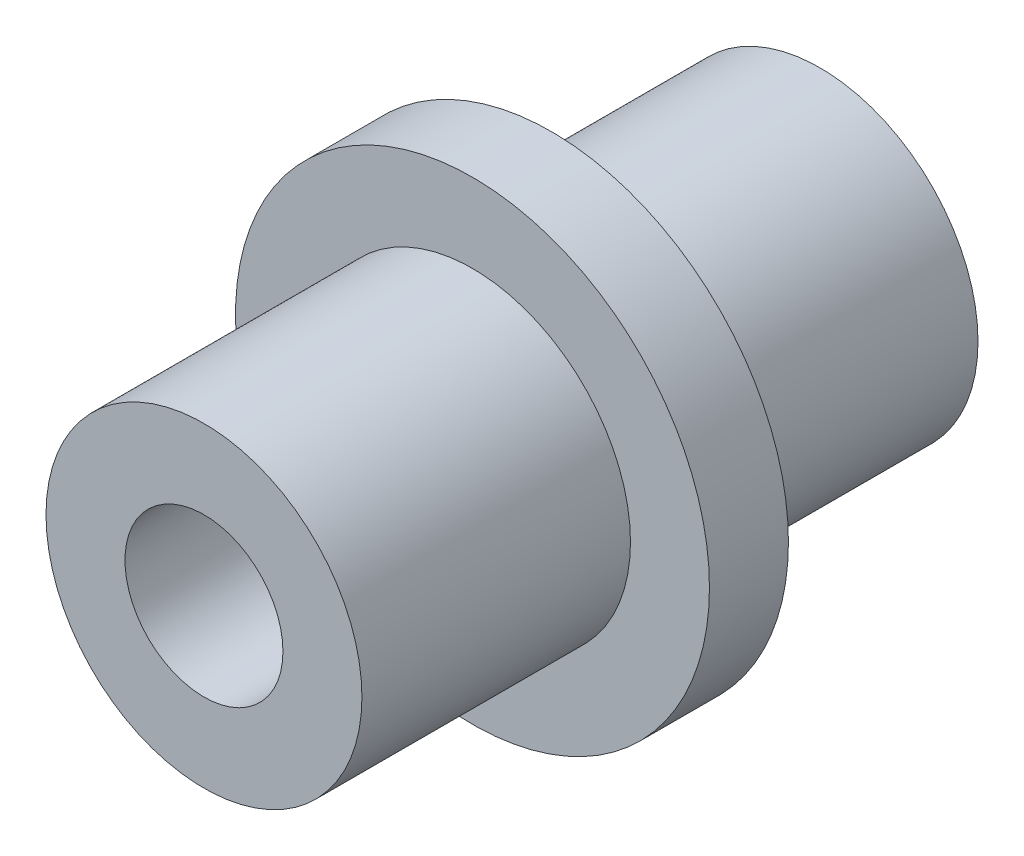
ISO-10303-21;
HEADER;
FILE_DESCRIPTION(('STEP AP214'),'2;1');
FILE_NAME('part.step','',(''),(''),'','','');
FILE_SCHEMA(('AUTOMOTIVE_DESIGN { 1 0 10303 214 1 1 1 1 }'));
ENDSEC;
DATA;
#1=APPLICATION_CONTEXT('core data for automotive mechanical design processes');
#2=APPLICATION_PROTOCOL_DEFINITION('international standard','automotive_design',2000,#1);
#3=PRODUCT_CONTEXT('',#1,'mechanical');
#4=PRODUCT('Part','Part','',(#3));
#5=PRODUCT_RELATED_PRODUCT_CATEGORY('part','',(#4));
#6=PRODUCT_DEFINITION_FORMATION('','',#4);
#7=PRODUCT_DEFINITION_CONTEXT('part definition',#1,'design');
#8=PRODUCT_DEFINITION('design','',#6,#7);
#9=PRODUCT_DEFINITION_SHAPE('','',#8);
#10=(LENGTH_UNIT() NAMED_UNIT(*) SI_UNIT(.MILLI.,.METRE.));
#11=(NAMED_UNIT(*) PLANE_ANGLE_UNIT() SI_UNIT($,.RADIAN.));
#12=(NAMED_UNIT(*) SI_UNIT($,.STERADIAN.) SOLID_ANGLE_UNIT());
#13=UNCERTAINTY_MEASURE_WITH_UNIT(LENGTH_MEASURE(1.E-05),#10,'distance_accuracy_value','');
#14=(GEOMETRIC_REPRESENTATION_CONTEXT(3) GLOBAL_UNCERTAINTY_ASSIGNED_CONTEXT((#13)) GLOBAL_UNIT_ASSIGNED_CONTEXT((#10,
#11,#12)) REPRESENTATION_CONTEXT('',''));
#15=CARTESIAN_POINT('',(0.,0.,0.));
#16=DIRECTION('',(0.,0.,1.));
#17=DIRECTION('',(1.,0.,0.));
#18=AXIS2_PLACEMENT_3D('',#15,#16,#17);
#19=CARTESIAN_POINT('',(0.,0.,0.5));
#20=DIRECTION('',(0.,0.,-1.));
#21=DIRECTION('',(-1.,0.,0.));
#22=AXIS2_PLACEMENT_3D('',#19,#20,#21);
#23=CYLINDRICAL_SURFACE('',#22,3.);
#24=CARTESIAN_POINT('',(0.,0.,0.5));
#25=DIRECTION('',(0.,0.,1.));
#26=DIRECTION('',(1.,0.,0.));
#27=AXIS2_PLACEMENT_3D('',#24,#25,#26);
#28=CIRCLE('',#27,3.);
#29=CARTESIAN_POINT('',(3.,0.,0.5));
#30=VERTEX_POINT('',#29);
#31=EDGE_CURVE('E49',#30,#30,#28,.T.);
#32=ORIENTED_EDGE('',*,*,#31,.F.);
#33=EDGE_LOOP('',(#32));
#34=FACE_BOUND('',#33,.T.);
#35=CARTESIAN_POINT('',(0.,0.,-0.5));
#36=DIRECTION('',(0.,0.,1.));
#37=DIRECTION('',(1.,0.,0.));
#38=AXIS2_PLACEMENT_3D('',#35,#36,#37);
#39=CIRCLE('',#38,3.);
#40=CARTESIAN_POINT('',(3.,0.,-0.5));
#41=VERTEX_POINT('',#40);
#42=EDGE_CURVE('E44',#41,#41,#39,.T.);
#43=ORIENTED_EDGE('',*,*,#42,.T.);
#44=EDGE_LOOP('',(#43));
#45=FACE_BOUND('',#44,.T.);
#46=ADVANCED_FACE('F41',(#34,#45),#23,.T.);
#47=CARTESIAN_POINT('',(0.,0.,0.5));
#48=DIRECTION('',(0.,0.,1.));
#49=DIRECTION('',(1.,0.,0.));
#50=AXIS2_PLACEMENT_3D('',#47,#48,#49);
#51=PLANE('',#50);
#52=CARTESIAN_POINT('',(0.,0.,0.5));
#53=DIRECTION('',(0.,0.,1.));
#54=DIRECTION('',(1.,0.,0.));
#55=AXIS2_PLACEMENT_3D('',#52,#53,#54);
#56=CIRCLE('',#55,2.);
#57=CARTESIAN_POINT('',(2.,0.,0.5));
#58=VERTEX_POINT('',#57);
#59=EDGE_CURVE('E10',#58,#58,#56,.T.);
#60=ORIENTED_EDGE('',*,*,#59,.F.);
#61=EDGE_LOOP('',(#60));
#62=FACE_BOUND('',#61,.T.);
#63=ORIENTED_EDGE('',*,*,#31,.T.);
#64=EDGE_LOOP('',(#63));
#65=FACE_BOUND('',#64,.T.);
#66=ADVANCED_FACE('F100',(#62,#65),#51,.T.);
#67=CARTESIAN_POINT('',(0.,0.,-0.5));
#68=DIRECTION('',(0.,0.,1.));
#69=DIRECTION('',(1.,0.,0.));
#70=AXIS2_PLACEMENT_3D('',#67,#68,#69);
#71=PLANE('',#70);
#72=CARTESIAN_POINT('',(0.,0.,-0.5));
#73=DIRECTION('',(0.,0.,1.));
#74=DIRECTION('',(1.,0.,0.));
#75=AXIS2_PLACEMENT_3D('',#72,#73,#74);
#76=CIRCLE('',#75,2.);
#77=CARTESIAN_POINT('',(2.,0.,-0.5));
#78=VERTEX_POINT('',#77);
#79=EDGE_CURVE('E61',#78,#78,#76,.T.);
#80=ORIENTED_EDGE('',*,*,#79,.T.);
#81=EDGE_LOOP('',(#80));
#82=FACE_BOUND('',#81,.T.);
#83=ORIENTED_EDGE('',*,*,#42,.F.);
#84=EDGE_LOOP('',(#83));
#85=FACE_BOUND('',#84,.T.);
#86=ADVANCED_FACE('F95',(#82,#85),#71,.F.);
#87=CARTESIAN_POINT('',(0.,0.,3.9));
#88=DIRECTION('',(0.,0.,-1.));
#89=DIRECTION('',(-1.,0.,0.));
#90=AXIS2_PLACEMENT_3D('',#87,#88,#89);
#91=CYLINDRICAL_SURFACE('',#90,2.);
#92=CARTESIAN_POINT('',(0.,0.,3.9));
#93=DIRECTION('',(0.,0.,1.));
#94=DIRECTION('',(1.,0.,0.));
#95=AXIS2_PLACEMENT_3D('',#92,#93,#94);
#96=CIRCLE('',#95,2.);
#97=CARTESIAN_POINT('',(2.,0.,3.9));
#98=VERTEX_POINT('',#97);
#99=EDGE_CURVE('E56',#98,#98,#96,.T.);
#100=ORIENTED_EDGE('',*,*,#99,.F.);
#101=EDGE_LOOP('',(#100));
#102=FACE_BOUND('',#101,.T.);
#103=ORIENTED_EDGE('',*,*,#59,.T.);
#104=EDGE_LOOP('',(#103));
#105=FACE_BOUND('',#104,.T.);
#106=ADVANCED_FACE('F90',(#102,#105),#91,.T.);
#107=CARTESIAN_POINT('',(0.,0.,3.9));
#108=DIRECTION('',(0.,0.,1.));
#109=DIRECTION('',(1.,0.,0.));
#110=AXIS2_PLACEMENT_3D('',#107,#108,#109);
#111=PLANE('',#110);
#112=CARTESIAN_POINT('',(0.,0.,3.9));
#113=DIRECTION('',(0.,0.,1.));
#114=DIRECTION('',(1.,0.,0.));
#115=AXIS2_PLACEMENT_3D('',#112,#113,#114);
#116=CIRCLE('',#115,1.);
#117=CARTESIAN_POINT('',(1.,0.,3.9));
#118=VERTEX_POINT('',#117);
#119=EDGE_CURVE('E69',#118,#118,#116,.T.);
#120=ORIENTED_EDGE('',*,*,#119,.F.);
#121=EDGE_LOOP('',(#120));
#122=FACE_BOUND('',#121,.T.);
#123=ORIENTED_EDGE('',*,*,#99,.T.);
#124=EDGE_LOOP('',(#123));
#125=FACE_BOUND('',#124,.T.);
#126=ADVANCED_FACE('F86',(#122,#125),#111,.T.);
#127=CARTESIAN_POINT('',(0.,0.,-3.9));
#128=DIRECTION('',(0.,0.,1.));
#129=DIRECTION('',(1.,0.,0.));
#130=AXIS2_PLACEMENT_3D('',#127,#128,#129);
#131=CYLINDRICAL_SURFACE('',#130,2.);
#132=CARTESIAN_POINT('',(0.,0.,-3.9));
#133=DIRECTION('',(0.,0.,1.));
#134=DIRECTION('',(1.,0.,0.));
#135=AXIS2_PLACEMENT_3D('',#132,#133,#134);
#136=CIRCLE('',#135,2.);
#137=CARTESIAN_POINT('',(2.,0.,-3.9));
#138=VERTEX_POINT('',#137);
#139=EDGE_CURVE('E60',#138,#138,#136,.T.);
#140=ORIENTED_EDGE('',*,*,#139,.T.);
#141=EDGE_LOOP('',(#140));
#142=FACE_BOUND('',#141,.T.);
#143=ORIENTED_EDGE('',*,*,#79,.F.);
#144=EDGE_LOOP('',(#143));
#145=FACE_BOUND('',#144,.T.);
#146=ADVANCED_FACE('F89',(#142,#145),#131,.T.);
#147=CARTESIAN_POINT('',(0.,0.,-3.9));
#148=DIRECTION('',(0.,0.,-1.));
#149=DIRECTION('',(1.,0.,0.));
#150=AXIS2_PLACEMENT_3D('',#147,#148,#149);
#151=PLANE('',#150);
#152=CARTESIAN_POINT('',(0.,0.,-3.9));
#153=DIRECTION('',(0.,0.,1.));
#154=DIRECTION('',(1.,0.,0.));
#155=AXIS2_PLACEMENT_3D('',#152,#153,#154);
#156=CIRCLE('',#155,1.);
#157=CARTESIAN_POINT('',(1.,0.,-3.9));
#158=VERTEX_POINT('',#157);
#159=EDGE_CURVE('E65',#158,#158,#156,.T.);
#160=ORIENTED_EDGE('',*,*,#159,.T.);
#161=EDGE_LOOP('',(#160));
#162=FACE_BOUND('',#161,.T.);
#163=ORIENTED_EDGE('',*,*,#139,.F.);
#164=EDGE_LOOP('',(#163));
#165=FACE_BOUND('',#164,.T.);
#166=ADVANCED_FACE('F77',(#162,#165),#151,.T.);
#167=CARTESIAN_POINT('',(0.,0.,-3.9));
#168=DIRECTION('',(0.,0.,1.));
#169=DIRECTION('',(1.,0.,0.));
#170=AXIS2_PLACEMENT_3D('',#167,#168,#169);
#171=CYLINDRICAL_SURFACE('',#170,1.);
#172=ORIENTED_EDGE('',*,*,#159,.F.);
#173=EDGE_LOOP('',(#172));
#174=FACE_BOUND('',#173,.T.);
#175=ORIENTED_EDGE('',*,*,#119,.T.);
#176=EDGE_LOOP('',(#175));
#177=FACE_BOUND('',#176,.T.);
#178=ADVANCED_FACE('F80',(#174,#177),#171,.F.);
#179=CLOSED_SHELL('',(#46,#66,#86,#106,#126,#146,#166,#178));
#180=MANIFOLD_SOLID_BREP('B2',#179);
#181=ADVANCED_BREP_SHAPE_REPRESENTATION('',(#18,#180),#14);
#182=SHAPE_DEFINITION_REPRESENTATION(#9,#181);
ENDSEC;
END-ISO-10303-21;
